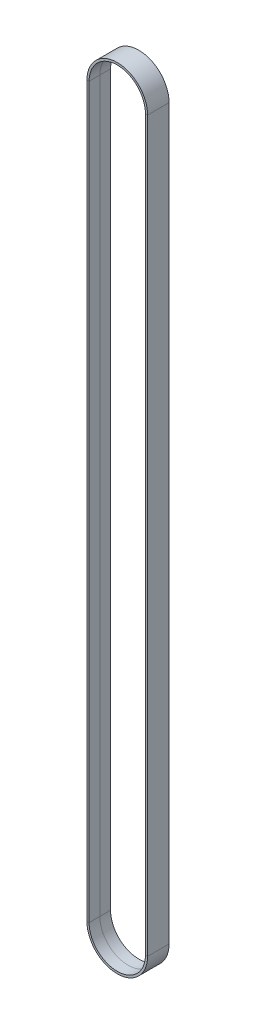
ISO-10303-21;
HEADER;
FILE_DESCRIPTION(('STEP AP214'),'2;1');
FILE_NAME('part.step','',(''),(''),'','','');
FILE_SCHEMA(('AUTOMOTIVE_DESIGN { 1 0 10303 214 1 1 1 1 }'));
ENDSEC;
DATA;
#1=APPLICATION_CONTEXT('core data for automotive mechanical design processes');
#2=APPLICATION_PROTOCOL_DEFINITION('international standard','automotive_design',2000,#1);
#3=PRODUCT_CONTEXT('',#1,'mechanical');
#4=PRODUCT('Part','Part','',(#3));
#5=PRODUCT_RELATED_PRODUCT_CATEGORY('part','',(#4));
#6=PRODUCT_DEFINITION_FORMATION('','',#4);
#7=PRODUCT_DEFINITION_CONTEXT('part definition',#1,'design');
#8=PRODUCT_DEFINITION('design','',#6,#7);
#9=PRODUCT_DEFINITION_SHAPE('','',#8);
#10=(LENGTH_UNIT() NAMED_UNIT(*) SI_UNIT(.MILLI.,.METRE.));
#11=(NAMED_UNIT(*) PLANE_ANGLE_UNIT() SI_UNIT($,.RADIAN.));
#12=(NAMED_UNIT(*) SI_UNIT($,.STERADIAN.) SOLID_ANGLE_UNIT());
#13=UNCERTAINTY_MEASURE_WITH_UNIT(LENGTH_MEASURE(1.E-05),#10,'distance_accuracy_value','');
#14=(GEOMETRIC_REPRESENTATION_CONTEXT(3) GLOBAL_UNCERTAINTY_ASSIGNED_CONTEXT((#13)) GLOBAL_UNIT_ASSIGNED_CONTEXT((#10,
#11,#12)) REPRESENTATION_CONTEXT('',''));
#15=CARTESIAN_POINT('',(0.,0.,0.));
#16=DIRECTION('',(0.,0.,1.));
#17=DIRECTION('',(1.,0.,0.));
#18=AXIS2_PLACEMENT_3D('',#15,#16,#17);
#19=CARTESIAN_POINT('',(-26.2500000000229,-5.94845899472062E-12,10.0000000000002));
#20=DIRECTION('',(0.,0.,-1.));
#21=DIRECTION('',(-1.,0.,0.));
#22=AXIS2_PLACEMENT_3D('',#19,#20,#21);
#23=PLANE('',#22);
#24=DIRECTION('',(-1.,0.,0.));
#25=VECTOR('',#24,1.);
#26=CARTESIAN_POINT('',(-26.2500000000229,0.,10.0000000000002));
#27=LINE('',#26,#25);
#28=CARTESIAN_POINT('',(-26.2499999999771,0.,10.0000000000002));
#29=VERTEX_POINT('',#28);
#30=CARTESIAN_POINT('',(-28.2499999999771,0.,10.0000000000002));
#31=VERTEX_POINT('',#30);
#32=EDGE_CURVE('E168',#29,#31,#27,.T.);
#33=ORIENTED_EDGE('',*,*,#32,.F.);
#34=CARTESIAN_POINT('',(2.28705943072782E-11,1.03750341651221E-09,10.0000000000002));
#35=DIRECTION('',(0.,0.,-1.));
#36=DIRECTION('',(-1.,-3.975054763829E-11,0.));
#37=AXIS2_PLACEMENT_3D('',#34,#35,#36);
#38=CIRCLE('',#37,26.2500000000457);
#39=CARTESIAN_POINT('',(26.2500000000229,0.,10.0000000000002));
#40=VERTEX_POINT('',#39);
#41=EDGE_CURVE('E167',#29,#40,#38,.T.);
#42=ORIENTED_EDGE('',*,*,#41,.T.);
#43=DIRECTION('',(1.,0.,0.));
#44=VECTOR('',#43,1.);
#45=CARTESIAN_POINT('',(26.2500000000229,0.,10.0000000000002));
#46=LINE('',#45,#44);
#47=CARTESIAN_POINT('',(28.2500000000229,0.,10.0000000000002));
#48=VERTEX_POINT('',#47);
#49=EDGE_CURVE('E147',#40,#48,#46,.T.);
#50=ORIENTED_EDGE('',*,*,#49,.T.);
#51=CARTESIAN_POINT('',(2.28705943072782E-11,1.03750341651221E-09,10.0000000000002));
#52=DIRECTION('',(0.,0.,-1.));
#53=DIRECTION('',(-1.,-3.69523926169432E-11,0.));
#54=AXIS2_PLACEMENT_3D('',#51,#52,#53);
#55=CIRCLE('',#54,28.2500000000457);
#56=EDGE_CURVE('E172',#31,#48,#55,.T.);
#57=ORIENTED_EDGE('',*,*,#56,.F.);
#58=EDGE_LOOP('',(#33,#42,#50,#57));
#59=FACE_BOUND('',#58,.T.);
#60=ADVANCED_FACE('F35',(#59),#23,.F.);
#61=CARTESIAN_POINT('',(26.2500000000229,0.,10.0000000000002));
#62=DIRECTION('',(0.,0.,-1.));
#63=DIRECTION('',(-1.,0.,0.));
#64=AXIS2_PLACEMENT_3D('',#61,#62,#63);
#65=PLANE('',#64);
#66=DIRECTION('',(0.,-1.,0.));
#67=VECTOR('',#66,1.);
#68=CARTESIAN_POINT('',(28.2500000000229,0.,10.0000000000002));
#69=LINE('',#68,#67);
#70=CARTESIAN_POINT('',(28.2500000000229,-678.678709754571,10.0000000000002));
#71=VERTEX_POINT('',#70);
#72=EDGE_CURVE('E130',#48,#71,#69,.T.);
#73=ORIENTED_EDGE('',*,*,#72,.F.);
#74=ORIENTED_EDGE('',*,*,#49,.F.);
#75=DIRECTION('',(0.,-1.,0.));
#76=VECTOR('',#75,1.);
#77=CARTESIAN_POINT('',(26.2500000000229,0.,10.0000000000002));
#78=LINE('',#77,#76);
#79=CARTESIAN_POINT('',(26.2500000000229,-678.678709754571,10.0000000000002));
#80=VERTEX_POINT('',#79);
#81=EDGE_CURVE('E152',#40,#80,#78,.T.);
#82=ORIENTED_EDGE('',*,*,#81,.T.);
#83=DIRECTION('',(1.,0.,0.));
#84=VECTOR('',#83,1.);
#85=CARTESIAN_POINT('',(26.2500000000229,-678.678709754571,10.0000000000002));
#86=LINE('',#85,#84);
#87=EDGE_CURVE('E164',#80,#71,#86,.T.);
#88=ORIENTED_EDGE('',*,*,#87,.T.);
#89=EDGE_LOOP('',(#73,#74,#82,#88));
#90=FACE_BOUND('',#89,.T.);
#91=ADVANCED_FACE('F151',(#90),#65,.F.);
#92=CARTESIAN_POINT('',(28.2500000000229,0.,-9.99999999999976));
#93=DIRECTION('',(-1.,0.,0.));
#94=DIRECTION('',(0.,0.,1.));
#95=AXIS2_PLACEMENT_3D('',#92,#93,#94);
#96=PLANE('',#95);
#97=DIRECTION('',(0.,-1.,0.));
#98=VECTOR('',#97,1.);
#99=CARTESIAN_POINT('',(28.2500000000229,0.,-9.99999999999976));
#100=LINE('',#99,#98);
#101=CARTESIAN_POINT('',(28.2500000000229,0.,-9.99999999999976));
#102=VERTEX_POINT('',#101);
#103=CARTESIAN_POINT('',(28.2500000000229,-678.678709754571,-9.99999999999976));
#104=VERTEX_POINT('',#103);
#105=EDGE_CURVE('E123',#102,#104,#100,.T.);
#106=ORIENTED_EDGE('',*,*,#105,.F.);
#107=DIRECTION('',(0.,0.,-1.));
#108=VECTOR('',#107,1.);
#109=CARTESIAN_POINT('',(28.2500000000229,0.,-9.99999999999976));
#110=LINE('',#109,#108);
#111=EDGE_CURVE('E154',#48,#102,#110,.T.);
#112=ORIENTED_EDGE('',*,*,#111,.F.);
#113=ORIENTED_EDGE('',*,*,#72,.T.);
#114=DIRECTION('',(0.,0.,-1.));
#115=VECTOR('',#114,1.);
#116=CARTESIAN_POINT('',(28.2500000000229,-678.678709754571,-9.99999999999976));
#117=LINE('',#116,#115);
#118=EDGE_CURVE('E230',#71,#104,#117,.T.);
#119=ORIENTED_EDGE('',*,*,#118,.T.);
#120=EDGE_LOOP('',(#106,#112,#113,#119));
#121=FACE_BOUND('',#120,.T.);
#122=ADVANCED_FACE('F252',(#121),#96,.F.);
#123=CARTESIAN_POINT('',(26.2500000000229,0.,-9.99999999999976));
#124=DIRECTION('',(0.,0.,1.));
#125=DIRECTION('',(1.,0.,0.));
#126=AXIS2_PLACEMENT_3D('',#123,#124,#125);
#127=PLANE('',#126);
#128=DIRECTION('',(0.,-1.,0.));
#129=VECTOR('',#128,1.);
#130=CARTESIAN_POINT('',(26.2500000000229,0.,-9.99999999999976));
#131=LINE('',#130,#129);
#132=CARTESIAN_POINT('',(26.2500000000229,0.,-9.99999999999976));
#133=VERTEX_POINT('',#132);
#134=CARTESIAN_POINT('',(26.2500000000229,-678.678709754571,-9.99999999999976));
#135=VERTEX_POINT('',#134);
#136=EDGE_CURVE('E116',#133,#135,#131,.T.);
#137=ORIENTED_EDGE('',*,*,#136,.F.);
#138=DIRECTION('',(-1.,0.,0.));
#139=VECTOR('',#138,1.);
#140=CARTESIAN_POINT('',(26.2500000000229,0.,-9.99999999999976));
#141=LINE('',#140,#139);
#142=EDGE_CURVE('E178',#102,#133,#141,.T.);
#143=ORIENTED_EDGE('',*,*,#142,.F.);
#144=ORIENTED_EDGE('',*,*,#105,.T.);
#145=DIRECTION('',(-1.,0.,0.));
#146=VECTOR('',#145,1.);
#147=CARTESIAN_POINT('',(26.2500000000229,-678.678709754571,-9.99999999999976));
#148=LINE('',#147,#146);
#149=EDGE_CURVE('E214',#104,#135,#148,.T.);
#150=ORIENTED_EDGE('',*,*,#149,.T.);
#151=EDGE_LOOP('',(#137,#143,#144,#150));
#152=FACE_BOUND('',#151,.T.);
#153=ADVANCED_FACE('F254',(#152),#127,.F.);
#154=CARTESIAN_POINT('',(26.2500000000229,0.,0.));
#155=DIRECTION('',(1.,0.,0.));
#156=DIRECTION('',(0.,0.,-1.));
#157=AXIS2_PLACEMENT_3D('',#154,#155,#156);
#158=PLANE('',#157);
#159=DIRECTION('',(0.,-1.,0.));
#160=VECTOR('',#159,1.);
#161=CARTESIAN_POINT('',(26.2500000000229,0.,0.));
#162=LINE('',#161,#160);
#163=CARTESIAN_POINT('',(26.2500000000229,0.,0.));
#164=VERTEX_POINT('',#163);
#165=CARTESIAN_POINT('',(26.2500000000229,-678.678709754571,0.));
#166=VERTEX_POINT('',#165);
#167=EDGE_CURVE('E183',#164,#166,#162,.T.);
#168=ORIENTED_EDGE('',*,*,#167,.F.);
#169=DIRECTION('',(0.,0.,1.));
#170=VECTOR('',#169,1.);
#171=CARTESIAN_POINT('',(26.2500000000229,0.,0.));
#172=LINE('',#171,#170);
#173=EDGE_CURVE('E175',#133,#164,#172,.T.);
#174=ORIENTED_EDGE('',*,*,#173,.F.);
#175=ORIENTED_EDGE('',*,*,#136,.T.);
#176=DIRECTION('',(0.,0.,1.));
#177=VECTOR('',#176,1.);
#178=CARTESIAN_POINT('',(26.2500000000229,-678.678709754571,0.));
#179=LINE('',#178,#177);
#180=EDGE_CURVE('E201',#135,#166,#179,.T.);
#181=ORIENTED_EDGE('',*,*,#180,.T.);
#182=EDGE_LOOP('',(#168,#174,#175,#181));
#183=FACE_BOUND('',#182,.T.);
#184=ADVANCED_FACE('F200',(#183),#158,.F.);
#185=CARTESIAN_POINT('',(26.2500000000229,0.,0.));
#186=DIRECTION('',(1.,0.,0.));
#187=DIRECTION('',(0.,0.,-1.));
#188=AXIS2_PLACEMENT_3D('',#185,#186,#187);
#189=PLANE('',#188);
#190=DIRECTION('',(0.,0.,1.));
#191=VECTOR('',#190,1.);
#192=CARTESIAN_POINT('',(26.2500000000229,-678.678709754571,0.));
#193=LINE('',#192,#191);
#194=EDGE_CURVE('E162',#166,#80,#193,.T.);
#195=ORIENTED_EDGE('',*,*,#194,.T.);
#196=ORIENTED_EDGE('',*,*,#81,.F.);
#197=DIRECTION('',(0.,0.,1.));
#198=VECTOR('',#197,1.);
#199=CARTESIAN_POINT('',(26.2500000000229,0.,0.));
#200=LINE('',#199,#198);
#201=EDGE_CURVE('E161',#164,#40,#200,.T.);
#202=ORIENTED_EDGE('',*,*,#201,.F.);
#203=ORIENTED_EDGE('',*,*,#167,.T.);
#204=EDGE_LOOP('',(#195,#196,#202,#203));
#205=FACE_BOUND('',#204,.T.);
#206=ADVANCED_FACE('F159',(#205),#189,.F.);
#207=CARTESIAN_POINT('',(26.2500000000229,-678.678709754577,10.0000000000002));
#208=DIRECTION('',(0.,0.,-1.));
#209=DIRECTION('',(-1.,0.,0.));
#210=AXIS2_PLACEMENT_3D('',#207,#208,#209);
#211=PLANE('',#210);
#212=CARTESIAN_POINT('',(2.28705943072782E-11,-678.678709753534,10.0000000000002));
#213=DIRECTION('',(0.,0.,-1.));
#214=DIRECTION('',(1.,-3.69380042777057E-11,0.));
#215=AXIS2_PLACEMENT_3D('',#212,#213,#214);
#216=CIRCLE('',#215,28.25);
#217=CARTESIAN_POINT('',(-28.2499999999771,-678.67870975249,10.0000000000002));
#218=VERTEX_POINT('',#217);
#219=EDGE_CURVE('E228',#71,#218,#216,.T.);
#220=ORIENTED_EDGE('',*,*,#219,.F.);
#221=ORIENTED_EDGE('',*,*,#87,.F.);
#222=CARTESIAN_POINT('',(2.28705943072782E-11,-678.678709753534,10.0000000000002));
#223=DIRECTION('',(0.,0.,-1.));
#224=DIRECTION('',(1.,-3.97523284131499E-11,0.));
#225=AXIS2_PLACEMENT_3D('',#222,#223,#224);
#226=CIRCLE('',#225,26.25);
#227=CARTESIAN_POINT('',(-26.2499999999771,-678.67870975249,10.0000000000002));
#228=VERTEX_POINT('',#227);
#229=EDGE_CURVE('E182',#80,#228,#226,.T.);
#230=ORIENTED_EDGE('',*,*,#229,.T.);
#231=DIRECTION('',(-1.,0.,0.));
#232=VECTOR('',#231,1.);
#233=CARTESIAN_POINT('',(-26.2499999999771,-678.67870975249,10.0000000000002));
#234=LINE('',#233,#232);
#235=EDGE_CURVE('E239',#228,#218,#234,.T.);
#236=ORIENTED_EDGE('',*,*,#235,.T.);
#237=EDGE_LOOP('',(#220,#221,#230,#236));
#238=FACE_BOUND('',#237,.T.);
#239=ADVANCED_FACE('F247',(#238),#211,.F.);
#240=CARTESIAN_POINT('',(2.28705943072782E-11,-678.678709753534,0.));
#241=DIRECTION('',(0.,0.,-1.));
#242=DIRECTION('',(-1.,0.,0.));
#243=AXIS2_PLACEMENT_3D('',#240,#241,#242);
#244=CYLINDRICAL_SURFACE('',#243,28.25);
#245=CARTESIAN_POINT('',(2.28705943072782E-11,-678.678709753534,-9.99999999999976));
#246=DIRECTION('',(0.,0.,-1.));
#247=DIRECTION('',(1.,-3.69380042777057E-11,0.));
#248=AXIS2_PLACEMENT_3D('',#245,#246,#247);
#249=CIRCLE('',#248,28.25);
#250=CARTESIAN_POINT('',(-28.2499999999771,-678.67870975249,-9.99999999999976));
#251=VERTEX_POINT('',#250);
#252=EDGE_CURVE('E102',#104,#251,#249,.T.);
#253=ORIENTED_EDGE('',*,*,#252,.F.);
#254=ORIENTED_EDGE('',*,*,#118,.F.);
#255=ORIENTED_EDGE('',*,*,#219,.T.);
#256=DIRECTION('',(0.,0.,-1.));
#257=VECTOR('',#256,1.);
#258=CARTESIAN_POINT('',(-28.2499999999771,-678.67870975249,-9.99999999999976));
#259=LINE('',#258,#257);
#260=EDGE_CURVE('E226',#218,#251,#259,.T.);
#261=ORIENTED_EDGE('',*,*,#260,.T.);
#262=EDGE_LOOP('',(#253,#254,#255,#261));
#263=FACE_BOUND('',#262,.T.);
#264=ADVANCED_FACE('F251',(#263),#244,.T.);
#265=CARTESIAN_POINT('',(26.2500000000229,-678.678709754577,-9.99999999999976));
#266=DIRECTION('',(0.,0.,1.));
#267=DIRECTION('',(1.,0.,0.));
#268=AXIS2_PLACEMENT_3D('',#265,#266,#267);
#269=PLANE('',#268);
#270=CARTESIAN_POINT('',(2.28705943072782E-11,-678.678709753534,-9.99999999999976));
#271=DIRECTION('',(0.,0.,-1.));
#272=DIRECTION('',(1.,-3.97523284131499E-11,0.));
#273=AXIS2_PLACEMENT_3D('',#270,#271,#272);
#274=CIRCLE('',#273,26.25);
#275=CARTESIAN_POINT('',(-26.2499999999771,-678.67870975249,-9.99999999999976));
#276=VERTEX_POINT('',#275);
#277=EDGE_CURVE('E94',#135,#276,#274,.T.);
#278=ORIENTED_EDGE('',*,*,#277,.F.);
#279=ORIENTED_EDGE('',*,*,#149,.F.);
#280=ORIENTED_EDGE('',*,*,#252,.T.);
#281=DIRECTION('',(1.,0.,0.));
#282=VECTOR('',#281,1.);
#283=CARTESIAN_POINT('',(-26.2499999999771,-678.67870975249,-9.99999999999976));
#284=LINE('',#283,#282);
#285=EDGE_CURVE('E211',#251,#276,#284,.T.);
#286=ORIENTED_EDGE('',*,*,#285,.T.);
#287=EDGE_LOOP('',(#278,#279,#280,#286));
#288=FACE_BOUND('',#287,.T.);
#289=ADVANCED_FACE('F279',(#288),#269,.F.);
#290=CARTESIAN_POINT('',(2.28705943072782E-11,-678.678709753534,0.));
#291=DIRECTION('',(0.,0.,-1.));
#292=DIRECTION('',(-1.,0.,0.));
#293=AXIS2_PLACEMENT_3D('',#290,#291,#292);
#294=CYLINDRICAL_SURFACE('',#293,26.25);
#295=CARTESIAN_POINT('',(2.28705943072782E-11,-678.678709753534,0.));
#296=DIRECTION('',(0.,0.,-1.));
#297=DIRECTION('',(1.,-3.97523284131499E-11,0.));
#298=AXIS2_PLACEMENT_3D('',#295,#296,#297);
#299=CIRCLE('',#298,26.25);
#300=CARTESIAN_POINT('',(-26.2499999999771,-678.67870975249,0.));
#301=VERTEX_POINT('',#300);
#302=EDGE_CURVE('E85',#166,#301,#299,.T.);
#303=ORIENTED_EDGE('',*,*,#302,.F.);
#304=ORIENTED_EDGE('',*,*,#180,.F.);
#305=ORIENTED_EDGE('',*,*,#277,.T.);
#306=DIRECTION('',(0.,0.,1.));
#307=VECTOR('',#306,1.);
#308=CARTESIAN_POINT('',(-26.2499999999771,-678.67870975249,0.));
#309=LINE('',#308,#307);
#310=EDGE_CURVE('E188',#276,#301,#309,.T.);
#311=ORIENTED_EDGE('',*,*,#310,.T.);
#312=EDGE_LOOP('',(#303,#304,#305,#311));
#313=FACE_BOUND('',#312,.T.);
#314=ADVANCED_FACE('F289',(#313),#294,.F.);
#315=CARTESIAN_POINT('',(2.28705943072782E-11,-678.678709753534,0.));
#316=DIRECTION('',(0.,0.,-1.));
#317=DIRECTION('',(-1.,0.,0.));
#318=AXIS2_PLACEMENT_3D('',#315,#316,#317);
#319=CYLINDRICAL_SURFACE('',#318,26.25);
#320=DIRECTION('',(0.,0.,1.));
#321=VECTOR('',#320,1.);
#322=CARTESIAN_POINT('',(-26.2499999999771,-678.67870975249,0.));
#323=LINE('',#322,#321);
#324=EDGE_CURVE('E184',#301,#228,#323,.T.);
#325=ORIENTED_EDGE('',*,*,#324,.T.);
#326=ORIENTED_EDGE('',*,*,#229,.F.);
#327=ORIENTED_EDGE('',*,*,#194,.F.);
#328=ORIENTED_EDGE('',*,*,#302,.T.);
#329=EDGE_LOOP('',(#325,#326,#327,#328));
#330=FACE_BOUND('',#329,.T.);
#331=ADVANCED_FACE('F272',(#330),#319,.F.);
#332=CARTESIAN_POINT('',(-26.2499999999771,-678.67870975249,10.0000000000002));
#333=DIRECTION('',(0.,0.,-1.));
#334=DIRECTION('',(-1.,0.,0.));
#335=AXIS2_PLACEMENT_3D('',#332,#333,#334);
#336=PLANE('',#335);
#337=DIRECTION('',(0.,1.,0.));
#338=VECTOR('',#337,1.);
#339=CARTESIAN_POINT('',(-28.2499999999771,-678.67870975249,10.0000000000002));
#340=LINE('',#339,#338);
#341=EDGE_CURVE('E224',#218,#31,#340,.T.);
#342=ORIENTED_EDGE('',*,*,#341,.F.);
#343=ORIENTED_EDGE('',*,*,#235,.F.);
#344=DIRECTION('',(0.,1.,0.));
#345=VECTOR('',#344,1.);
#346=CARTESIAN_POINT('',(-26.2499999999771,-678.67870975249,10.0000000000002));
#347=LINE('',#346,#345);
#348=EDGE_CURVE('E185',#228,#29,#347,.T.);
#349=ORIENTED_EDGE('',*,*,#348,.T.);
#350=ORIENTED_EDGE('',*,*,#32,.T.);
#351=EDGE_LOOP('',(#342,#343,#349,#350));
#352=FACE_BOUND('',#351,.T.);
#353=ADVANCED_FACE('F268',(#352),#336,.F.);
#354=CARTESIAN_POINT('',(-28.2499999999771,-678.67870975249,-9.99999999999976));
#355=DIRECTION('',(1.,0.,0.));
#356=DIRECTION('',(0.,0.,-1.));
#357=AXIS2_PLACEMENT_3D('',#354,#355,#356);
#358=PLANE('',#357);
#359=DIRECTION('',(0.,1.,0.));
#360=VECTOR('',#359,1.);
#361=CARTESIAN_POINT('',(-28.2499999999771,-678.67870975249,-9.99999999999976));
#362=LINE('',#361,#360);
#363=CARTESIAN_POINT('',(-28.2499999999771,0.,-9.99999999999976));
#364=VERTEX_POINT('',#363);
#365=EDGE_CURVE('E209',#251,#364,#362,.T.);
#366=ORIENTED_EDGE('',*,*,#365,.F.);
#367=ORIENTED_EDGE('',*,*,#260,.F.);
#368=ORIENTED_EDGE('',*,*,#341,.T.);
#369=DIRECTION('',(0.,0.,-1.));
#370=VECTOR('',#369,1.);
#371=CARTESIAN_POINT('',(-28.2500000000229,0.,-9.99999999999976));
#372=LINE('',#371,#370);
#373=EDGE_CURVE('E221',#31,#364,#372,.T.);
#374=ORIENTED_EDGE('',*,*,#373,.T.);
#375=EDGE_LOOP('',(#366,#367,#368,#374));
#376=FACE_BOUND('',#375,.T.);
#377=ADVANCED_FACE('F271',(#376),#358,.F.);
#378=CARTESIAN_POINT('',(-26.2499999999771,-678.67870975249,-9.99999999999976));
#379=DIRECTION('',(0.,0.,1.));
#380=DIRECTION('',(1.,0.,0.));
#381=AXIS2_PLACEMENT_3D('',#378,#379,#380);
#382=PLANE('',#381);
#383=DIRECTION('',(0.,1.,0.));
#384=VECTOR('',#383,1.);
#385=CARTESIAN_POINT('',(-26.2499999999771,-678.67870975249,-9.99999999999976));
#386=LINE('',#385,#384);
#387=CARTESIAN_POINT('',(-26.2499999999771,0.,-9.99999999999976));
#388=VERTEX_POINT('',#387);
#389=EDGE_CURVE('E60',#276,#388,#386,.T.);
#390=ORIENTED_EDGE('',*,*,#389,.F.);
#391=ORIENTED_EDGE('',*,*,#285,.F.);
#392=ORIENTED_EDGE('',*,*,#365,.T.);
#393=DIRECTION('',(1.,0.,0.));
#394=VECTOR('',#393,1.);
#395=CARTESIAN_POINT('',(-26.2500000000229,0.,-9.99999999999976));
#396=LINE('',#395,#394);
#397=EDGE_CURVE('E207',#364,#388,#396,.T.);
#398=ORIENTED_EDGE('',*,*,#397,.T.);
#399=EDGE_LOOP('',(#390,#391,#392,#398));
#400=FACE_BOUND('',#399,.T.);
#401=ADVANCED_FACE('F300',(#400),#382,.F.);
#402=CARTESIAN_POINT('',(-26.2499999999771,-678.67870975249,0.));
#403=DIRECTION('',(-1.,0.,0.));
#404=DIRECTION('',(0.,0.,1.));
#405=AXIS2_PLACEMENT_3D('',#402,#403,#404);
#406=PLANE('',#405);
#407=DIRECTION('',(0.,1.,0.));
#408=VECTOR('',#407,1.);
#409=CARTESIAN_POINT('',(-26.2499999999771,-678.67870975249,0.));
#410=LINE('',#409,#408);
#411=CARTESIAN_POINT('',(-26.2499999999771,0.,0.));
#412=VERTEX_POINT('',#411);
#413=EDGE_CURVE('E52',#301,#412,#410,.T.);
#414=ORIENTED_EDGE('',*,*,#413,.F.);
#415=ORIENTED_EDGE('',*,*,#310,.F.);
#416=ORIENTED_EDGE('',*,*,#389,.T.);
#417=DIRECTION('',(0.,0.,1.));
#418=VECTOR('',#417,1.);
#419=CARTESIAN_POINT('',(-26.2500000000229,0.,0.));
#420=LINE('',#419,#418);
#421=EDGE_CURVE('E193',#388,#412,#420,.T.);
#422=ORIENTED_EDGE('',*,*,#421,.T.);
#423=EDGE_LOOP('',(#414,#415,#416,#422));
#424=FACE_BOUND('',#423,.T.);
#425=ADVANCED_FACE('F292',(#424),#406,.F.);
#426=CARTESIAN_POINT('',(-26.2499999999771,-678.67870975249,0.));
#427=DIRECTION('',(-1.,0.,0.));
#428=DIRECTION('',(0.,0.,1.));
#429=AXIS2_PLACEMENT_3D('',#426,#427,#428);
#430=PLANE('',#429);
#431=DIRECTION('',(0.,0.,1.));
#432=VECTOR('',#431,1.);
#433=CARTESIAN_POINT('',(-26.2500000000229,0.,0.));
#434=LINE('',#433,#432);
#435=EDGE_CURVE('E39',#412,#29,#434,.T.);
#436=ORIENTED_EDGE('',*,*,#435,.T.);
#437=ORIENTED_EDGE('',*,*,#348,.F.);
#438=ORIENTED_EDGE('',*,*,#324,.F.);
#439=ORIENTED_EDGE('',*,*,#413,.T.);
#440=EDGE_LOOP('',(#436,#437,#438,#439));
#441=FACE_BOUND('',#440,.T.);
#442=ADVANCED_FACE('F194',(#441),#430,.F.);
#443=CARTESIAN_POINT('',(2.28705943072782E-11,1.03750341651221E-09,0.));
#444=DIRECTION('',(0.,0.,-1.));
#445=DIRECTION('',(-1.,0.,0.));
#446=AXIS2_PLACEMENT_3D('',#443,#444,#445);
#447=CYLINDRICAL_SURFACE('',#446,28.2500000000457);
#448=ORIENTED_EDGE('',*,*,#56,.T.);
#449=ORIENTED_EDGE('',*,*,#111,.T.);
#450=CARTESIAN_POINT('',(2.28705943072782E-11,1.03750341651221E-09,-9.99999999999976));
#451=DIRECTION('',(0.,0.,-1.));
#452=DIRECTION('',(-1.,-3.69523926169432E-11,0.));
#453=AXIS2_PLACEMENT_3D('',#450,#451,#452);
#454=CIRCLE('',#453,28.2500000000457);
#455=EDGE_CURVE('E205',#364,#102,#454,.T.);
#456=ORIENTED_EDGE('',*,*,#455,.F.);
#457=ORIENTED_EDGE('',*,*,#373,.F.);
#458=EDGE_LOOP('',(#448,#449,#456,#457));
#459=FACE_BOUND('',#458,.T.);
#460=ADVANCED_FACE('F291',(#459),#447,.T.);
#461=CARTESIAN_POINT('',(-26.2500000000229,-5.94845899472062E-12,-9.99999999999976));
#462=DIRECTION('',(0.,0.,1.));
#463=DIRECTION('',(1.,0.,0.));
#464=AXIS2_PLACEMENT_3D('',#461,#462,#463);
#465=PLANE('',#464);
#466=ORIENTED_EDGE('',*,*,#455,.T.);
#467=ORIENTED_EDGE('',*,*,#142,.T.);
#468=CARTESIAN_POINT('',(2.28705943072782E-11,1.03750341651221E-09,-9.99999999999976));
#469=DIRECTION('',(0.,0.,-1.));
#470=DIRECTION('',(-1.,-3.975054763829E-11,0.));
#471=AXIS2_PLACEMENT_3D('',#468,#469,#470);
#472=CIRCLE('',#471,26.2500000000457);
#473=EDGE_CURVE('E44',#388,#133,#472,.T.);
#474=ORIENTED_EDGE('',*,*,#473,.F.);
#475=ORIENTED_EDGE('',*,*,#397,.F.);
#476=EDGE_LOOP('',(#466,#467,#474,#475));
#477=FACE_BOUND('',#476,.T.);
#478=ADVANCED_FACE('F297',(#477),#465,.F.);
#479=CARTESIAN_POINT('',(2.28705943072782E-11,1.03750341651221E-09,0.));
#480=DIRECTION('',(0.,0.,-1.));
#481=DIRECTION('',(-1.,0.,0.));
#482=AXIS2_PLACEMENT_3D('',#479,#480,#481);
#483=CYLINDRICAL_SURFACE('',#482,26.2500000000457);
#484=ORIENTED_EDGE('',*,*,#473,.T.);
#485=ORIENTED_EDGE('',*,*,#173,.T.);
#486=CARTESIAN_POINT('',(2.28705943072782E-11,1.03750341651221E-09,0.));
#487=DIRECTION('',(0.,0.,-1.));
#488=DIRECTION('',(-1.,-3.975054763829E-11,0.));
#489=AXIS2_PLACEMENT_3D('',#486,#487,#488);
#490=CIRCLE('',#489,26.2500000000457);
#491=EDGE_CURVE('E11',#412,#164,#490,.T.);
#492=ORIENTED_EDGE('',*,*,#491,.F.);
#493=ORIENTED_EDGE('',*,*,#421,.F.);
#494=EDGE_LOOP('',(#484,#485,#492,#493));
#495=FACE_BOUND('',#494,.T.);
#496=ADVANCED_FACE('F198',(#495),#483,.F.);
#497=CARTESIAN_POINT('',(2.28705943072782E-11,1.03750341651221E-09,0.));
#498=DIRECTION('',(0.,0.,-1.));
#499=DIRECTION('',(-1.,0.,0.));
#500=AXIS2_PLACEMENT_3D('',#497,#498,#499);
#501=CYLINDRICAL_SURFACE('',#500,26.2500000000457);
#502=ORIENTED_EDGE('',*,*,#491,.T.);
#503=ORIENTED_EDGE('',*,*,#201,.T.);
#504=ORIENTED_EDGE('',*,*,#41,.F.);
#505=ORIENTED_EDGE('',*,*,#435,.F.);
#506=EDGE_LOOP('',(#502,#503,#504,#505));
#507=FACE_BOUND('',#506,.T.);
#508=ADVANCED_FACE('F37',(#507),#501,.F.);
#509=CLOSED_SHELL('',(#60,#91,#122,#153,#184,#206,#239,#264,#289,#314,#331,#353,#377,#401,#425,
#442,#460,#478,#496,#508));
#510=MANIFOLD_SOLID_BREP('B2',#509);
#511=ADVANCED_BREP_SHAPE_REPRESENTATION('',(#18,#510),#14);
#512=SHAPE_DEFINITION_REPRESENTATION(#9,#511);
ENDSEC;
END-ISO-10303-21;
